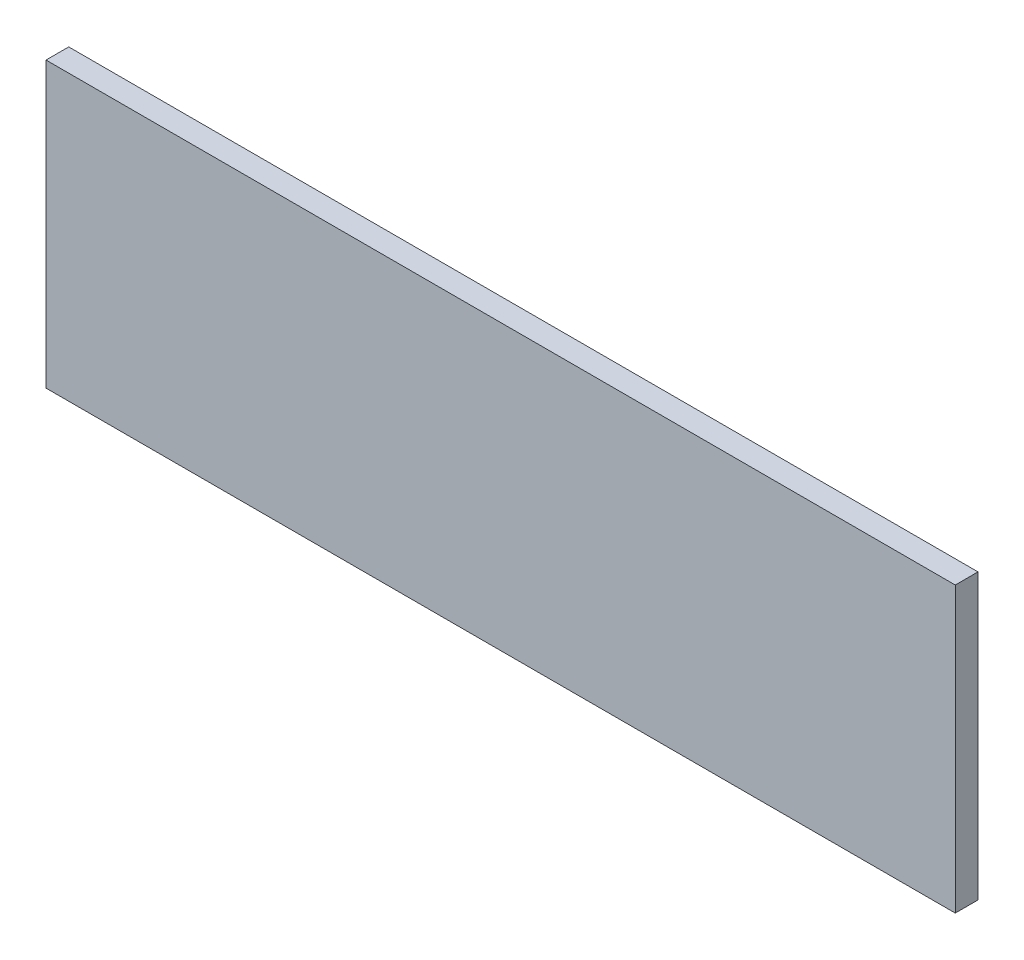
ISO-10303-21;
HEADER;
FILE_DESCRIPTION(('STEP AP214'),'2;1');
FILE_NAME('part.step','',(''),(''),'','','');
FILE_SCHEMA(('AUTOMOTIVE_DESIGN { 1 0 10303 214 1 1 1 1 }'));
ENDSEC;
DATA;
#1=APPLICATION_CONTEXT('core data for automotive mechanical design processes');
#2=APPLICATION_PROTOCOL_DEFINITION('international standard','automotive_design',2000,#1);
#3=PRODUCT_CONTEXT('',#1,'mechanical');
#4=PRODUCT('Part','Part','',(#3));
#5=PRODUCT_RELATED_PRODUCT_CATEGORY('part','',(#4));
#6=PRODUCT_DEFINITION_FORMATION('','',#4);
#7=PRODUCT_DEFINITION_CONTEXT('part definition',#1,'design');
#8=PRODUCT_DEFINITION('design','',#6,#7);
#9=PRODUCT_DEFINITION_SHAPE('','',#8);
#10=(LENGTH_UNIT() NAMED_UNIT(*) SI_UNIT(.MILLI.,.METRE.));
#11=(NAMED_UNIT(*) PLANE_ANGLE_UNIT() SI_UNIT($,.RADIAN.));
#12=(NAMED_UNIT(*) SI_UNIT($,.STERADIAN.) SOLID_ANGLE_UNIT());
#13=UNCERTAINTY_MEASURE_WITH_UNIT(LENGTH_MEASURE(1.E-05),#10,'distance_accuracy_value','');
#14=(GEOMETRIC_REPRESENTATION_CONTEXT(3) GLOBAL_UNCERTAINTY_ASSIGNED_CONTEXT((#13)) GLOBAL_UNIT_ASSIGNED_CONTEXT((#10,
#11,#12)) REPRESENTATION_CONTEXT('',''));
#15=CARTESIAN_POINT('',(0.,0.,0.));
#16=DIRECTION('',(0.,0.,1.));
#17=DIRECTION('',(1.,0.,0.));
#18=AXIS2_PLACEMENT_3D('',#15,#16,#17);
#19=CARTESIAN_POINT('',(40.,-12.5,2.));
#20=DIRECTION('',(-1.,0.,0.));
#21=DIRECTION('',(0.,0.,1.));
#22=AXIS2_PLACEMENT_3D('',#19,#20,#21);
#23=PLANE('',#22);
#24=DIRECTION('',(0.,1.,0.));
#25=VECTOR('',#24,1.);
#26=CARTESIAN_POINT('',(40.,-12.5,0.));
#27=LINE('',#26,#25);
#28=CARTESIAN_POINT('',(40.,-12.5,0.));
#29=VERTEX_POINT('',#28);
#30=CARTESIAN_POINT('',(40.,12.5,0.));
#31=VERTEX_POINT('',#30);
#32=EDGE_CURVE('E111',#29,#31,#27,.T.);
#33=ORIENTED_EDGE('',*,*,#32,.T.);
#34=DIRECTION('',(0.,0.,-1.));
#35=VECTOR('',#34,1.);
#36=CARTESIAN_POINT('',(40.,12.5,2.));
#37=LINE('',#36,#35);
#38=CARTESIAN_POINT('',(40.,12.5,2.));
#39=VERTEX_POINT('',#38);
#40=EDGE_CURVE('E11',#39,#31,#37,.T.);
#41=ORIENTED_EDGE('',*,*,#40,.F.);
#42=DIRECTION('',(0.,1.,0.));
#43=VECTOR('',#42,1.);
#44=CARTESIAN_POINT('',(40.,-12.5,2.));
#45=LINE('',#44,#43);
#46=CARTESIAN_POINT('',(40.,-12.5,2.));
#47=VERTEX_POINT('',#46);
#48=EDGE_CURVE('E93',#47,#39,#45,.T.);
#49=ORIENTED_EDGE('',*,*,#48,.F.);
#50=DIRECTION('',(0.,0.,-1.));
#51=VECTOR('',#50,1.);
#52=CARTESIAN_POINT('',(40.,-12.5,2.));
#53=LINE('',#52,#51);
#54=EDGE_CURVE('E107',#47,#29,#53,.T.);
#55=ORIENTED_EDGE('',*,*,#54,.T.);
#56=EDGE_LOOP('',(#33,#41,#49,#55));
#57=FACE_BOUND('',#56,.T.);
#58=ADVANCED_FACE('F39',(#57),#23,.F.);
#59=CARTESIAN_POINT('',(-40.,12.5,2.));
#60=DIRECTION('',(0.,-1.,0.));
#61=DIRECTION('',(0.,0.,-1.));
#62=AXIS2_PLACEMENT_3D('',#59,#60,#61);
#63=PLANE('',#62);
#64=DIRECTION('',(-1.,0.,0.));
#65=VECTOR('',#64,1.);
#66=CARTESIAN_POINT('',(-40.,12.5,0.));
#67=LINE('',#66,#65);
#68=CARTESIAN_POINT('',(-40.,12.5,0.));
#69=VERTEX_POINT('',#68);
#70=EDGE_CURVE('E98',#31,#69,#67,.T.);
#71=ORIENTED_EDGE('',*,*,#70,.T.);
#72=DIRECTION('',(0.,0.,-1.));
#73=VECTOR('',#72,1.);
#74=CARTESIAN_POINT('',(-40.,12.5,2.));
#75=LINE('',#74,#73);
#76=CARTESIAN_POINT('',(-40.,12.5,2.));
#77=VERTEX_POINT('',#76);
#78=EDGE_CURVE('E47',#77,#69,#75,.T.);
#79=ORIENTED_EDGE('',*,*,#78,.F.);
#80=DIRECTION('',(-1.,0.,0.));
#81=VECTOR('',#80,1.);
#82=CARTESIAN_POINT('',(-40.,12.5,2.));
#83=LINE('',#82,#81);
#84=EDGE_CURVE('E87',#39,#77,#83,.T.);
#85=ORIENTED_EDGE('',*,*,#84,.F.);
#86=ORIENTED_EDGE('',*,*,#40,.T.);
#87=EDGE_LOOP('',(#71,#79,#85,#86));
#88=FACE_BOUND('',#87,.T.);
#89=ADVANCED_FACE('F97',(#88),#63,.F.);
#90=CARTESIAN_POINT('',(-40.,-12.5,2.));
#91=DIRECTION('',(1.,0.,0.));
#92=DIRECTION('',(0.,0.,-1.));
#93=AXIS2_PLACEMENT_3D('',#90,#91,#92);
#94=PLANE('',#93);
#95=DIRECTION('',(0.,-1.,0.));
#96=VECTOR('',#95,1.);
#97=CARTESIAN_POINT('',(-40.,-12.5,0.));
#98=LINE('',#97,#96);
#99=CARTESIAN_POINT('',(-40.,-12.5,0.));
#100=VERTEX_POINT('',#99);
#101=EDGE_CURVE('E74',#69,#100,#98,.T.);
#102=ORIENTED_EDGE('',*,*,#101,.T.);
#103=DIRECTION('',(0.,0.,-1.));
#104=VECTOR('',#103,1.);
#105=CARTESIAN_POINT('',(-40.,-12.5,2.));
#106=LINE('',#105,#104);
#107=CARTESIAN_POINT('',(-40.,-12.5,2.));
#108=VERTEX_POINT('',#107);
#109=EDGE_CURVE('E100',#108,#100,#106,.T.);
#110=ORIENTED_EDGE('',*,*,#109,.F.);
#111=DIRECTION('',(0.,-1.,0.));
#112=VECTOR('',#111,1.);
#113=CARTESIAN_POINT('',(-40.,-12.5,2.));
#114=LINE('',#113,#112);
#115=EDGE_CURVE('E91',#77,#108,#114,.T.);
#116=ORIENTED_EDGE('',*,*,#115,.F.);
#117=ORIENTED_EDGE('',*,*,#78,.T.);
#118=EDGE_LOOP('',(#102,#110,#116,#117));
#119=FACE_BOUND('',#118,.T.);
#120=ADVANCED_FACE('F101',(#119),#94,.F.);
#121=CARTESIAN_POINT('',(-40.,-12.5,2.));
#122=DIRECTION('',(0.,1.,0.));
#123=DIRECTION('',(0.,0.,1.));
#124=AXIS2_PLACEMENT_3D('',#121,#122,#123);
#125=PLANE('',#124);
#126=DIRECTION('',(1.,0.,0.));
#127=VECTOR('',#126,1.);
#128=CARTESIAN_POINT('',(-40.,-12.5,0.));
#129=LINE('',#128,#127);
#130=EDGE_CURVE('E80',#100,#29,#129,.T.);
#131=ORIENTED_EDGE('',*,*,#130,.T.);
#132=ORIENTED_EDGE('',*,*,#54,.F.);
#133=DIRECTION('',(1.,0.,0.));
#134=VECTOR('',#133,1.);
#135=CARTESIAN_POINT('',(-40.,-12.5,2.));
#136=LINE('',#135,#134);
#137=EDGE_CURVE('E57',#108,#47,#136,.T.);
#138=ORIENTED_EDGE('',*,*,#137,.F.);
#139=ORIENTED_EDGE('',*,*,#109,.T.);
#140=EDGE_LOOP('',(#131,#132,#138,#139));
#141=FACE_BOUND('',#140,.T.);
#142=ADVANCED_FACE('F120',(#141),#125,.F.);
#143=CARTESIAN_POINT('',(0.,0.,2.));
#144=DIRECTION('',(0.,0.,-1.));
#145=DIRECTION('',(-1.,0.,0.));
#146=AXIS2_PLACEMENT_3D('',#143,#144,#145);
#147=PLANE('',#146);
#148=ORIENTED_EDGE('',*,*,#48,.T.);
#149=ORIENTED_EDGE('',*,*,#84,.T.);
#150=ORIENTED_EDGE('',*,*,#115,.T.);
#151=ORIENTED_EDGE('',*,*,#137,.T.);
#152=EDGE_LOOP('',(#148,#149,#150,#151));
#153=FACE_BOUND('',#152,.T.);
#154=ADVANCED_FACE('F89',(#153),#147,.F.);
#155=CARTESIAN_POINT('',(0.,0.,0.));
#156=DIRECTION('',(0.,0.,-1.));
#157=DIRECTION('',(-1.,0.,0.));
#158=AXIS2_PLACEMENT_3D('',#155,#156,#157);
#159=PLANE('',#158);
#160=ORIENTED_EDGE('',*,*,#32,.F.);
#161=ORIENTED_EDGE('',*,*,#130,.F.);
#162=ORIENTED_EDGE('',*,*,#101,.F.);
#163=ORIENTED_EDGE('',*,*,#70,.F.);
#164=EDGE_LOOP('',(#160,#161,#162,#163));
#165=FACE_BOUND('',#164,.T.);
#166=ADVANCED_FACE('F123',(#165),#159,.T.);
#167=CLOSED_SHELL('',(#58,#89,#120,#142,#154,#166));
#168=MANIFOLD_SOLID_BREP('B2',#167);
#169=ADVANCED_BREP_SHAPE_REPRESENTATION('',(#18,#168),#14);
#170=SHAPE_DEFINITION_REPRESENTATION(#9,#169);
ENDSEC;
END-ISO-10303-21;
